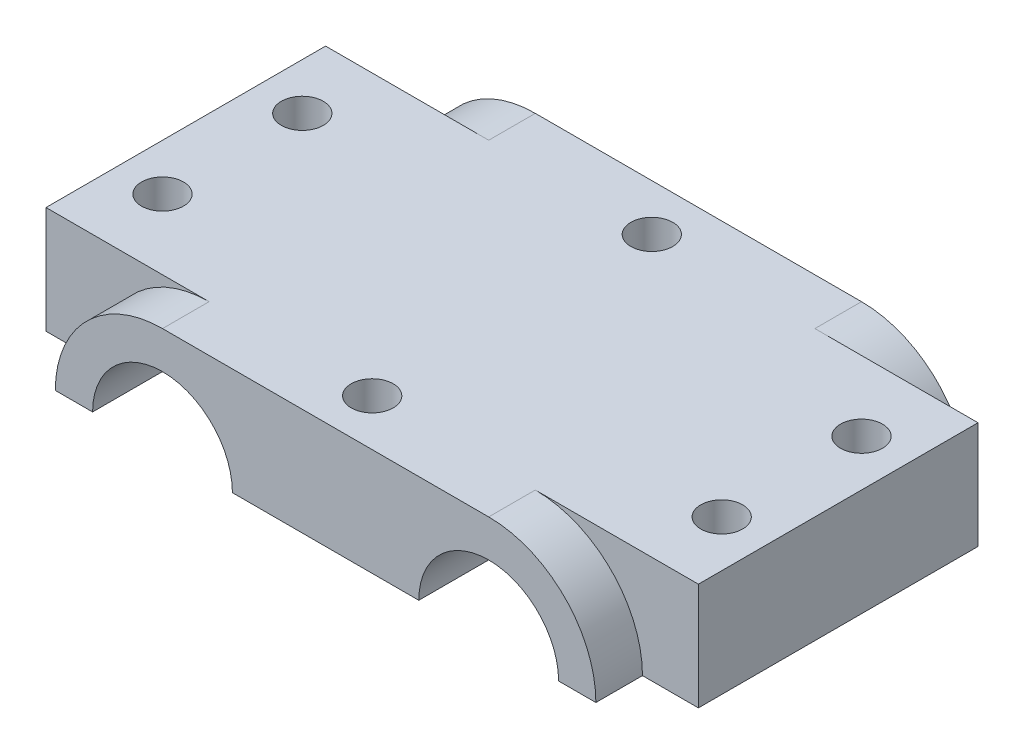
ISO-10303-21;
HEADER;
FILE_DESCRIPTION(('STEP AP214'),'2;1');
FILE_NAME('part.step','',(''),(''),'','','');
FILE_SCHEMA(('AUTOMOTIVE_DESIGN { 1 0 10303 214 1 1 1 1 }'));
ENDSEC;
DATA;
#1=APPLICATION_CONTEXT('core data for automotive mechanical design processes');
#2=APPLICATION_PROTOCOL_DEFINITION('international standard','automotive_design',2000,#1);
#3=PRODUCT_CONTEXT('',#1,'mechanical');
#4=PRODUCT('Part','Part','',(#3));
#5=PRODUCT_RELATED_PRODUCT_CATEGORY('part','',(#4));
#6=PRODUCT_DEFINITION_FORMATION('','',#4);
#7=PRODUCT_DEFINITION_CONTEXT('part definition',#1,'design');
#8=PRODUCT_DEFINITION('design','',#6,#7);
#9=PRODUCT_DEFINITION_SHAPE('','',#8);
#10=(LENGTH_UNIT() NAMED_UNIT(*) SI_UNIT(.MILLI.,.METRE.));
#11=(NAMED_UNIT(*) PLANE_ANGLE_UNIT() SI_UNIT($,.RADIAN.));
#12=(NAMED_UNIT(*) SI_UNIT($,.STERADIAN.) SOLID_ANGLE_UNIT());
#13=UNCERTAINTY_MEASURE_WITH_UNIT(LENGTH_MEASURE(1.E-05),#10,'distance_accuracy_value','');
#14=(GEOMETRIC_REPRESENTATION_CONTEXT(3) GLOBAL_UNCERTAINTY_ASSIGNED_CONTEXT((#13)) GLOBAL_UNIT_ASSIGNED_CONTEXT((#10,
#11,#12)) REPRESENTATION_CONTEXT('',''));
#15=CARTESIAN_POINT('',(0.,0.,0.));
#16=DIRECTION('',(0.,0.,1.));
#17=DIRECTION('',(1.,0.,0.));
#18=AXIS2_PLACEMENT_3D('',#15,#16,#17);
#19=CARTESIAN_POINT('',(35.,5.75,20.));
#20=DIRECTION('',(-1.,0.,0.));
#21=DIRECTION('',(0.,0.,1.));
#22=AXIS2_PLACEMENT_3D('',#19,#20,#21);
#23=PLANE('',#22);
#24=DIRECTION('',(0.,1.,0.));
#25=VECTOR('',#24,1.);
#26=CARTESIAN_POINT('',(35.,-5.75,-15.));
#27=LINE('',#26,#25);
#28=CARTESIAN_POINT('',(35.,-5.75,-15.));
#29=VERTEX_POINT('',#28);
#30=CARTESIAN_POINT('',(35.,5.75,-15.));
#31=VERTEX_POINT('',#30);
#32=EDGE_CURVE('E180',#29,#31,#27,.T.);
#33=ORIENTED_EDGE('',*,*,#32,.T.);
#34=DIRECTION('',(0.,0.,-1.));
#35=VECTOR('',#34,1.);
#36=CARTESIAN_POINT('',(35.,5.75,20.));
#37=LINE('',#36,#35);
#38=CARTESIAN_POINT('',(35.,5.75,15.));
#39=VERTEX_POINT('',#38);
#40=EDGE_CURVE('E11',#39,#31,#37,.T.);
#41=ORIENTED_EDGE('',*,*,#40,.F.);
#42=DIRECTION('',(0.,1.,0.));
#43=VECTOR('',#42,1.);
#44=CARTESIAN_POINT('',(35.,-5.75,15.));
#45=LINE('',#44,#43);
#46=CARTESIAN_POINT('',(35.,-5.75,15.));
#47=VERTEX_POINT('',#46);
#48=EDGE_CURVE('E226',#47,#39,#45,.T.);
#49=ORIENTED_EDGE('',*,*,#48,.F.);
#50=DIRECTION('',(0.,0.,-1.));
#51=VECTOR('',#50,1.);
#52=CARTESIAN_POINT('',(35.,-5.75,20.));
#53=LINE('',#52,#51);
#54=EDGE_CURVE('E303',#47,#29,#53,.T.);
#55=ORIENTED_EDGE('',*,*,#54,.T.);
#56=EDGE_LOOP('',(#33,#41,#49,#55));
#57=FACE_BOUND('',#56,.T.);
#58=ADVANCED_FACE('F45',(#57),#23,.F.);
#59=CARTESIAN_POINT('',(-35.,5.75,20.));
#60=DIRECTION('',(0.,-1.,0.));
#61=DIRECTION('',(0.,0.,-1.));
#62=AXIS2_PLACEMENT_3D('',#59,#60,#61);
#63=PLANE('',#62);
#64=CARTESIAN_POINT('',(0.,5.75,-15.));
#65=DIRECTION('',(0.,1.,0.));
#66=DIRECTION('',(0.,0.,1.));
#67=AXIS2_PLACEMENT_3D('',#64,#65,#66);
#68=CIRCLE('',#67,2.25000000000001);
#69=CARTESIAN_POINT('',(0.,5.75,-12.75));
#70=VERTEX_POINT('',#69);
#71=EDGE_CURVE('E549',#70,#70,#68,.T.);
#72=ORIENTED_EDGE('',*,*,#71,.F.);
#73=EDGE_LOOP('',(#72));
#74=FACE_BOUND('',#73,.T.);
#75=CARTESIAN_POINT('',(0.,5.75,15.));
#76=DIRECTION('',(0.,1.,0.));
#77=DIRECTION('',(0.,0.,1.));
#78=AXIS2_PLACEMENT_3D('',#75,#76,#77);
#79=CIRCLE('',#78,2.25000000000001);
#80=CARTESIAN_POINT('',(0.,5.75,17.25));
#81=VERTEX_POINT('',#80);
#82=EDGE_CURVE('E553',#81,#81,#79,.T.);
#83=ORIENTED_EDGE('',*,*,#82,.F.);
#84=EDGE_LOOP('',(#83));
#85=FACE_BOUND('',#84,.T.);
#86=CARTESIAN_POINT('',(-30.,5.75,7.5));
#87=DIRECTION('',(0.,1.,0.));
#88=DIRECTION('',(0.,0.,1.));
#89=AXIS2_PLACEMENT_3D('',#86,#87,#88);
#90=CIRCLE('',#89,2.25000000000001);
#91=CARTESIAN_POINT('',(-30.,5.75,9.75000000000001));
#92=VERTEX_POINT('',#91);
#93=EDGE_CURVE('E563',#92,#92,#90,.T.);
#94=ORIENTED_EDGE('',*,*,#93,.F.);
#95=EDGE_LOOP('',(#94));
#96=FACE_BOUND('',#95,.T.);
#97=CARTESIAN_POINT('',(-30.,5.75,-7.5));
#98=DIRECTION('',(0.,1.,0.));
#99=DIRECTION('',(0.,0.,1.));
#100=AXIS2_PLACEMENT_3D('',#97,#98,#99);
#101=CIRCLE('',#100,2.25000000000001);
#102=CARTESIAN_POINT('',(-30.,5.75,-5.24999999999999));
#103=VERTEX_POINT('',#102);
#104=EDGE_CURVE('E571',#103,#103,#101,.T.);
#105=ORIENTED_EDGE('',*,*,#104,.F.);
#106=EDGE_LOOP('',(#105));
#107=FACE_BOUND('',#106,.T.);
#108=CARTESIAN_POINT('',(30.,5.75,7.5));
#109=DIRECTION('',(0.,1.,0.));
#110=DIRECTION('',(0.,0.,1.));
#111=AXIS2_PLACEMENT_3D('',#108,#109,#110);
#112=CIRCLE('',#111,2.25000000000001);
#113=CARTESIAN_POINT('',(30.,5.75,9.75000000000001));
#114=VERTEX_POINT('',#113);
#115=EDGE_CURVE('E579',#114,#114,#112,.T.);
#116=ORIENTED_EDGE('',*,*,#115,.F.);
#117=EDGE_LOOP('',(#116));
#118=FACE_BOUND('',#117,.T.);
#119=CARTESIAN_POINT('',(30.,5.75,-7.5));
#120=DIRECTION('',(0.,1.,0.));
#121=DIRECTION('',(0.,0.,1.));
#122=AXIS2_PLACEMENT_3D('',#119,#120,#121);
#123=CIRCLE('',#122,2.25000000000001);
#124=CARTESIAN_POINT('',(30.,5.75,-5.24999999999999));
#125=VERTEX_POINT('',#124);
#126=EDGE_CURVE('E587',#125,#125,#123,.T.);
#127=ORIENTED_EDGE('',*,*,#126,.F.);
#128=EDGE_LOOP('',(#127));
#129=FACE_BOUND('',#128,.T.);
#130=DIRECTION('',(-1.,0.,0.));
#131=VECTOR('',#130,1.);
#132=CARTESIAN_POINT('',(35.,5.75,-15.));
#133=LINE('',#132,#131);
#134=CARTESIAN_POINT('',(17.5,5.75,-15.));
#135=VERTEX_POINT('',#134);
#136=EDGE_CURVE('E171',#31,#135,#133,.T.);
#137=ORIENTED_EDGE('',*,*,#136,.T.);
#138=DIRECTION('',(0.,0.,-1.));
#139=VECTOR('',#138,1.);
#140=CARTESIAN_POINT('',(17.5,5.75,-15.));
#141=LINE('',#140,#139);
#142=CARTESIAN_POINT('',(17.5,5.75,-20.));
#143=VERTEX_POINT('',#142);
#144=EDGE_CURVE('E157',#135,#143,#141,.T.);
#145=ORIENTED_EDGE('',*,*,#144,.T.);
#146=DIRECTION('',(-1.,0.,0.));
#147=VECTOR('',#146,1.);
#148=CARTESIAN_POINT('',(-35.,5.75,-20.));
#149=LINE('',#148,#147);
#150=CARTESIAN_POINT('',(-17.5,5.75,-20.));
#151=VERTEX_POINT('',#150);
#152=EDGE_CURVE('E278',#143,#151,#149,.T.);
#153=ORIENTED_EDGE('',*,*,#152,.T.);
#154=DIRECTION('',(0.,0.,-1.));
#155=VECTOR('',#154,1.);
#156=CARTESIAN_POINT('',(-17.5,5.74999999999999,-15.));
#157=LINE('',#156,#155);
#158=CARTESIAN_POINT('',(-17.5,5.74999999999999,-15.));
#159=VERTEX_POINT('',#158);
#160=EDGE_CURVE('E68',#159,#151,#157,.T.);
#161=ORIENTED_EDGE('',*,*,#160,.F.);
#162=DIRECTION('',(-1.,0.,0.));
#163=VECTOR('',#162,1.);
#164=CARTESIAN_POINT('',(-17.5,5.74999999999999,-15.));
#165=LINE('',#164,#163);
#166=CARTESIAN_POINT('',(-35.,5.75,-15.));
#167=VERTEX_POINT('',#166);
#168=EDGE_CURVE('E194',#159,#167,#165,.T.);
#169=ORIENTED_EDGE('',*,*,#168,.T.);
#170=DIRECTION('',(0.,0.,-1.));
#171=VECTOR('',#170,1.);
#172=CARTESIAN_POINT('',(-35.,5.75,20.));
#173=LINE('',#172,#171);
#174=CARTESIAN_POINT('',(-35.,5.75,15.));
#175=VERTEX_POINT('',#174);
#176=EDGE_CURVE('E53',#175,#167,#173,.T.);
#177=ORIENTED_EDGE('',*,*,#176,.F.);
#178=DIRECTION('',(-1.,0.,0.));
#179=VECTOR('',#178,1.);
#180=CARTESIAN_POINT('',(-17.5,5.74999999999999,15.));
#181=LINE('',#180,#179);
#182=CARTESIAN_POINT('',(-17.5,5.74999999999999,15.));
#183=VERTEX_POINT('',#182);
#184=EDGE_CURVE('E253',#183,#175,#181,.T.);
#185=ORIENTED_EDGE('',*,*,#184,.F.);
#186=DIRECTION('',(0.,0.,1.));
#187=VECTOR('',#186,1.);
#188=CARTESIAN_POINT('',(-17.5,5.74999999999999,15.));
#189=LINE('',#188,#187);
#190=CARTESIAN_POINT('',(-17.5,5.74999999999999,20.));
#191=VERTEX_POINT('',#190);
#192=EDGE_CURVE('E192',#183,#191,#189,.T.);
#193=ORIENTED_EDGE('',*,*,#192,.T.);
#194=DIRECTION('',(-1.,0.,0.));
#195=VECTOR('',#194,1.);
#196=CARTESIAN_POINT('',(-35.,5.75,20.));
#197=LINE('',#196,#195);
#198=CARTESIAN_POINT('',(17.5,5.75,20.));
#199=VERTEX_POINT('',#198);
#200=EDGE_CURVE('E294',#199,#191,#197,.T.);
#201=ORIENTED_EDGE('',*,*,#200,.F.);
#202=DIRECTION('',(0.,0.,1.));
#203=VECTOR('',#202,1.);
#204=CARTESIAN_POINT('',(17.5,5.75,15.));
#205=LINE('',#204,#203);
#206=CARTESIAN_POINT('',(17.5,5.75,15.));
#207=VERTEX_POINT('',#206);
#208=EDGE_CURVE('E237',#207,#199,#205,.T.);
#209=ORIENTED_EDGE('',*,*,#208,.F.);
#210=DIRECTION('',(-1.,0.,0.));
#211=VECTOR('',#210,1.);
#212=CARTESIAN_POINT('',(35.,5.75,15.));
#213=LINE('',#212,#211);
#214=EDGE_CURVE('E229',#39,#207,#213,.T.);
#215=ORIENTED_EDGE('',*,*,#214,.F.);
#216=ORIENTED_EDGE('',*,*,#40,.T.);
#217=EDGE_LOOP('',(#137,#145,#153,#161,#169,#177,#185,#193,#201,#209,#215,#216));
#218=FACE_BOUND('',#217,.T.);
#219=ADVANCED_FACE('F176',(#74,#85,#96,#107,#118,#129,#218),#63,.F.);
#220=CARTESIAN_POINT('',(-35.,-5.75,20.));
#221=DIRECTION('',(0.,1.,0.));
#222=DIRECTION('',(0.,0.,1.));
#223=AXIS2_PLACEMENT_3D('',#220,#221,#222);
#224=PLANE('',#223);
#225=CARTESIAN_POINT('',(-30.,-5.75,7.5));
#226=DIRECTION('',(0.,1.,0.));
#227=DIRECTION('',(0.,0.,1.));
#228=AXIS2_PLACEMENT_3D('',#225,#226,#227);
#229=CIRCLE('',#228,2.25000000000001);
#230=CARTESIAN_POINT('',(-30.,-5.75,9.75000000000001));
#231=VERTEX_POINT('',#230);
#232=EDGE_CURVE('E567',#231,#231,#229,.T.);
#233=ORIENTED_EDGE('',*,*,#232,.T.);
#234=EDGE_LOOP('',(#233));
#235=FACE_BOUND('',#234,.T.);
#236=CARTESIAN_POINT('',(-30.,-5.75,-7.5));
#237=DIRECTION('',(0.,1.,0.));
#238=DIRECTION('',(0.,0.,1.));
#239=AXIS2_PLACEMENT_3D('',#236,#237,#238);
#240=CIRCLE('',#239,2.25000000000001);
#241=CARTESIAN_POINT('',(-30.,-5.75,-5.24999999999999));
#242=VERTEX_POINT('',#241);
#243=EDGE_CURVE('E575',#242,#242,#240,.T.);
#244=ORIENTED_EDGE('',*,*,#243,.T.);
#245=EDGE_LOOP('',(#244));
#246=FACE_BOUND('',#245,.T.);
#247=DIRECTION('',(0.,0.,-1.));
#248=VECTOR('',#247,1.);
#249=CARTESIAN_POINT('',(-29.,-5.75,-15.));
#250=LINE('',#249,#248);
#251=CARTESIAN_POINT('',(-29.,-5.75,-15.));
#252=VERTEX_POINT('',#251);
#253=CARTESIAN_POINT('',(-29.,-5.75,-20.));
#254=VERTEX_POINT('',#253);
#255=EDGE_CURVE('E190',#252,#254,#250,.T.);
#256=ORIENTED_EDGE('',*,*,#255,.T.);
#257=DIRECTION('',(1.,0.,0.));
#258=VECTOR('',#257,1.);
#259=CARTESIAN_POINT('',(-35.,-5.75,-20.));
#260=LINE('',#259,#258);
#261=CARTESIAN_POINT('',(-25.,-5.75,-20.));
#262=VERTEX_POINT('',#261);
#263=EDGE_CURVE('E299',#254,#262,#260,.T.);
#264=ORIENTED_EDGE('',*,*,#263,.T.);
#265=DIRECTION('',(0.,0.,1.));
#266=VECTOR('',#265,1.);
#267=CARTESIAN_POINT('',(-25.,-5.75,-20.));
#268=LINE('',#267,#266);
#269=CARTESIAN_POINT('',(-25.,-5.75,20.));
#270=VERTEX_POINT('',#269);
#271=EDGE_CURVE('E269',#262,#270,#268,.T.);
#272=ORIENTED_EDGE('',*,*,#271,.T.);
#273=DIRECTION('',(1.,0.,0.));
#274=VECTOR('',#273,1.);
#275=CARTESIAN_POINT('',(-35.,-5.75,20.));
#276=LINE('',#275,#274);
#277=CARTESIAN_POINT('',(-29.,-5.75,20.));
#278=VERTEX_POINT('',#277);
#279=EDGE_CURVE('E300',#278,#270,#276,.T.);
#280=ORIENTED_EDGE('',*,*,#279,.F.);
#281=DIRECTION('',(0.,0.,1.));
#282=VECTOR('',#281,1.);
#283=CARTESIAN_POINT('',(-29.,-5.75,15.));
#284=LINE('',#283,#282);
#285=CARTESIAN_POINT('',(-29.,-5.75,15.));
#286=VERTEX_POINT('',#285);
#287=EDGE_CURVE('E244',#286,#278,#284,.T.);
#288=ORIENTED_EDGE('',*,*,#287,.F.);
#289=DIRECTION('',(1.,0.,0.));
#290=VECTOR('',#289,1.);
#291=CARTESIAN_POINT('',(-35.,-5.75,15.));
#292=LINE('',#291,#290);
#293=CARTESIAN_POINT('',(-35.,-5.75,15.));
#294=VERTEX_POINT('',#293);
#295=EDGE_CURVE('E257',#294,#286,#292,.T.);
#296=ORIENTED_EDGE('',*,*,#295,.F.);
#297=DIRECTION('',(0.,0.,-1.));
#298=VECTOR('',#297,1.);
#299=CARTESIAN_POINT('',(-35.,-5.75,20.));
#300=LINE('',#299,#298);
#301=CARTESIAN_POINT('',(-35.,-5.75,-15.));
#302=VERTEX_POINT('',#301);
#303=EDGE_CURVE('E314',#294,#302,#300,.T.);
#304=ORIENTED_EDGE('',*,*,#303,.T.);
#305=DIRECTION('',(1.,0.,0.));
#306=VECTOR('',#305,1.);
#307=CARTESIAN_POINT('',(-35.,-5.75,-15.));
#308=LINE('',#307,#306);
#309=EDGE_CURVE('E202',#302,#252,#308,.T.);
#310=ORIENTED_EDGE('',*,*,#309,.T.);
#311=EDGE_LOOP('',(#256,#264,#272,#280,#288,#296,#304,#310));
#312=FACE_BOUND('',#311,.T.);
#313=ADVANCED_FACE('F330',(#235,#246,#312),#224,.F.);
#314=CARTESIAN_POINT('',(30.,-5.75,7.5));
#315=DIRECTION('',(0.,1.,0.));
#316=DIRECTION('',(0.,0.,1.));
#317=AXIS2_PLACEMENT_3D('',#314,#315,#316);
#318=CIRCLE('',#317,2.25000000000001);
#319=CARTESIAN_POINT('',(30.,-5.75,9.75000000000001));
#320=VERTEX_POINT('',#319);
#321=EDGE_CURVE('E583',#320,#320,#318,.T.);
#322=ORIENTED_EDGE('',*,*,#321,.T.);
#323=EDGE_LOOP('',(#322));
#324=FACE_BOUND('',#323,.T.);
#325=CARTESIAN_POINT('',(30.,-5.75,-7.5));
#326=DIRECTION('',(0.,1.,0.));
#327=DIRECTION('',(0.,0.,1.));
#328=AXIS2_PLACEMENT_3D('',#325,#326,#327);
#329=CIRCLE('',#328,2.25000000000001);
#330=CARTESIAN_POINT('',(30.,-5.75,-5.24999999999999));
#331=VERTEX_POINT('',#330);
#332=EDGE_CURVE('E212',#331,#331,#329,.T.);
#333=ORIENTED_EDGE('',*,*,#332,.T.);
#334=EDGE_LOOP('',(#333));
#335=FACE_BOUND('',#334,.T.);
#336=DIRECTION('',(0.,0.,-1.));
#337=VECTOR('',#336,1.);
#338=CARTESIAN_POINT('',(29.,-5.75,-15.));
#339=LINE('',#338,#337);
#340=CARTESIAN_POINT('',(29.,-5.75,-15.));
#341=VERTEX_POINT('',#340);
#342=CARTESIAN_POINT('',(29.,-5.75,-20.));
#343=VERTEX_POINT('',#342);
#344=EDGE_CURVE('E60',#341,#343,#339,.T.);
#345=ORIENTED_EDGE('',*,*,#344,.F.);
#346=DIRECTION('',(1.,0.,0.));
#347=VECTOR('',#346,1.);
#348=CARTESIAN_POINT('',(29.,-5.75,-15.));
#349=LINE('',#348,#347);
#350=EDGE_CURVE('E167',#341,#29,#349,.T.);
#351=ORIENTED_EDGE('',*,*,#350,.T.);
#352=ORIENTED_EDGE('',*,*,#54,.F.);
#353=DIRECTION('',(1.,0.,0.));
#354=VECTOR('',#353,1.);
#355=CARTESIAN_POINT('',(29.,-5.75,15.));
#356=LINE('',#355,#354);
#357=CARTESIAN_POINT('',(29.,-5.75,15.));
#358=VERTEX_POINT('',#357);
#359=EDGE_CURVE('E222',#358,#47,#356,.T.);
#360=ORIENTED_EDGE('',*,*,#359,.F.);
#361=DIRECTION('',(0.,0.,1.));
#362=VECTOR('',#361,1.);
#363=CARTESIAN_POINT('',(29.,-5.75,15.));
#364=LINE('',#363,#362);
#365=CARTESIAN_POINT('',(29.,-5.75,20.));
#366=VERTEX_POINT('',#365);
#367=EDGE_CURVE('E233',#358,#366,#364,.T.);
#368=ORIENTED_EDGE('',*,*,#367,.T.);
#369=CARTESIAN_POINT('',(25.,-5.75,20.));
#370=VERTEX_POINT('',#369);
#371=EDGE_CURVE('E298',#370,#366,#276,.T.);
#372=ORIENTED_EDGE('',*,*,#371,.F.);
#373=DIRECTION('',(0.,0.,1.));
#374=VECTOR('',#373,1.);
#375=CARTESIAN_POINT('',(25.,-5.75,-20.));
#376=LINE('',#375,#374);
#377=CARTESIAN_POINT('',(25.,-5.75,-20.));
#378=VERTEX_POINT('',#377);
#379=EDGE_CURVE('E240',#378,#370,#376,.T.);
#380=ORIENTED_EDGE('',*,*,#379,.F.);
#381=EDGE_CURVE('E307',#378,#343,#260,.T.);
#382=ORIENTED_EDGE('',*,*,#381,.T.);
#383=EDGE_LOOP('',(#345,#351,#352,#360,#368,#372,#380,#382));
#384=FACE_BOUND('',#383,.T.);
#385=ADVANCED_FACE('F353',(#324,#335,#384),#224,.F.);
#386=CARTESIAN_POINT('',(0.,0.,-20.));
#387=DIRECTION('',(0.,0.,1.));
#388=DIRECTION('',(1.,0.,0.));
#389=AXIS2_PLACEMENT_3D('',#386,#387,#388);
#390=PLANE('',#389);
#391=CARTESIAN_POINT('',(17.5,-5.75,-20.));
#392=DIRECTION('',(0.,0.,-1.));
#393=DIRECTION('',(1.,0.,0.));
#394=AXIS2_PLACEMENT_3D('',#391,#392,#393);
#395=CIRCLE('',#394,11.5);
#396=EDGE_CURVE('E161',#143,#343,#395,.T.);
#397=ORIENTED_EDGE('',*,*,#396,.T.);
#398=ORIENTED_EDGE('',*,*,#381,.F.);
#399=CARTESIAN_POINT('',(17.5,-5.75,-20.));
#400=DIRECTION('',(0.,0.,1.));
#401=DIRECTION('',(-1.,0.,0.));
#402=AXIS2_PLACEMENT_3D('',#399,#400,#401);
#403=CIRCLE('',#402,7.5);
#404=CARTESIAN_POINT('',(10.,-5.75,-20.));
#405=VERTEX_POINT('',#404);
#406=EDGE_CURVE('E286',#378,#405,#403,.T.);
#407=ORIENTED_EDGE('',*,*,#406,.T.);
#408=CARTESIAN_POINT('',(-10.,-5.75,-20.));
#409=VERTEX_POINT('',#408);
#410=EDGE_CURVE('E310',#409,#405,#260,.T.);
#411=ORIENTED_EDGE('',*,*,#410,.F.);
#412=CARTESIAN_POINT('',(-17.5,-5.75,-20.));
#413=DIRECTION('',(0.,0.,1.));
#414=DIRECTION('',(-1.,0.,0.));
#415=AXIS2_PLACEMENT_3D('',#412,#413,#414);
#416=CIRCLE('',#415,7.5);
#417=EDGE_CURVE('E265',#409,#262,#416,.T.);
#418=ORIENTED_EDGE('',*,*,#417,.T.);
#419=ORIENTED_EDGE('',*,*,#263,.F.);
#420=CARTESIAN_POINT('',(-17.5,-5.75,-20.));
#421=DIRECTION('',(0.,0.,-1.));
#422=DIRECTION('',(-1.,0.,0.));
#423=AXIS2_PLACEMENT_3D('',#420,#421,#422);
#424=CIRCLE('',#423,11.5);
#425=EDGE_CURVE('E199',#254,#151,#424,.T.);
#426=ORIENTED_EDGE('',*,*,#425,.T.);
#427=ORIENTED_EDGE('',*,*,#152,.F.);
#428=EDGE_LOOP('',(#397,#398,#407,#411,#418,#419,#426,#427));
#429=FACE_BOUND('',#428,.T.);
#430=ADVANCED_FACE('F372',(#429),#390,.F.);
#431=CARTESIAN_POINT('',(0.,-5.75,-15.));
#432=DIRECTION('',(0.,1.,0.));
#433=DIRECTION('',(0.,0.,1.));
#434=AXIS2_PLACEMENT_3D('',#431,#432,#433);
#435=CIRCLE('',#434,2.25000000000001);
#436=CARTESIAN_POINT('',(0.,-5.75,-12.75));
#437=VERTEX_POINT('',#436);
#438=EDGE_CURVE('E547',#437,#437,#435,.T.);
#439=ORIENTED_EDGE('',*,*,#438,.T.);
#440=EDGE_LOOP('',(#439));
#441=FACE_BOUND('',#440,.T.);
#442=CARTESIAN_POINT('',(0.,-5.75,15.));
#443=DIRECTION('',(0.,1.,0.));
#444=DIRECTION('',(0.,0.,1.));
#445=AXIS2_PLACEMENT_3D('',#442,#443,#444);
#446=CIRCLE('',#445,2.25000000000001);
#447=CARTESIAN_POINT('',(0.,-5.75,17.25));
#448=VERTEX_POINT('',#447);
#449=EDGE_CURVE('E559',#448,#448,#446,.T.);
#450=ORIENTED_EDGE('',*,*,#449,.T.);
#451=EDGE_LOOP('',(#450));
#452=FACE_BOUND('',#451,.T.);
#453=CARTESIAN_POINT('',(-10.,-5.75,20.));
#454=VERTEX_POINT('',#453);
#455=CARTESIAN_POINT('',(10.,-5.75,20.));
#456=VERTEX_POINT('',#455);
#457=EDGE_CURVE('E304',#454,#456,#276,.T.);
#458=ORIENTED_EDGE('',*,*,#457,.F.);
#459=DIRECTION('',(0.,0.,1.));
#460=VECTOR('',#459,1.);
#461=CARTESIAN_POINT('',(-10.,-5.75,-20.));
#462=LINE('',#461,#460);
#463=EDGE_CURVE('E275',#409,#454,#462,.T.);
#464=ORIENTED_EDGE('',*,*,#463,.F.);
#465=ORIENTED_EDGE('',*,*,#410,.T.);
#466=DIRECTION('',(0.,0.,1.));
#467=VECTOR('',#466,1.);
#468=CARTESIAN_POINT('',(10.,-5.75,-20.));
#469=LINE('',#468,#467);
#470=EDGE_CURVE('E282',#405,#456,#469,.T.);
#471=ORIENTED_EDGE('',*,*,#470,.T.);
#472=EDGE_LOOP('',(#458,#464,#465,#471));
#473=FACE_BOUND('',#472,.T.);
#474=ADVANCED_FACE('F370',(#441,#452,#473),#224,.F.);
#475=CARTESIAN_POINT('',(-35.,5.75,20.));
#476=DIRECTION('',(1.,0.,0.));
#477=DIRECTION('',(0.,0.,-1.));
#478=AXIS2_PLACEMENT_3D('',#475,#476,#477);
#479=PLANE('',#478);
#480=ORIENTED_EDGE('',*,*,#176,.T.);
#481=DIRECTION('',(0.,-1.,0.));
#482=VECTOR('',#481,1.);
#483=CARTESIAN_POINT('',(-35.,5.75,-15.));
#484=LINE('',#483,#482);
#485=EDGE_CURVE('E206',#167,#302,#484,.T.);
#486=ORIENTED_EDGE('',*,*,#485,.T.);
#487=ORIENTED_EDGE('',*,*,#303,.F.);
#488=DIRECTION('',(0.,-1.,0.));
#489=VECTOR('',#488,1.);
#490=CARTESIAN_POINT('',(-35.,5.75,15.));
#491=LINE('',#490,#489);
#492=EDGE_CURVE('E260',#175,#294,#491,.T.);
#493=ORIENTED_EDGE('',*,*,#492,.F.);
#494=EDGE_LOOP('',(#480,#486,#487,#493));
#495=FACE_BOUND('',#494,.T.);
#496=ADVANCED_FACE('F322',(#495),#479,.F.);
#497=CARTESIAN_POINT('',(0.,0.,20.));
#498=DIRECTION('',(0.,0.,1.));
#499=DIRECTION('',(1.,0.,0.));
#500=AXIS2_PLACEMENT_3D('',#497,#498,#499);
#501=PLANE('',#500);
#502=CARTESIAN_POINT('',(17.5,-5.75,20.));
#503=DIRECTION('',(0.,0.,-1.));
#504=DIRECTION('',(1.,0.,0.));
#505=AXIS2_PLACEMENT_3D('',#502,#503,#504);
#506=CIRCLE('',#505,11.5);
#507=EDGE_CURVE('E223',#199,#366,#506,.T.);
#508=ORIENTED_EDGE('',*,*,#507,.F.);
#509=ORIENTED_EDGE('',*,*,#200,.T.);
#510=CARTESIAN_POINT('',(-17.5,-5.75,20.));
#511=DIRECTION('',(0.,0.,-1.));
#512=DIRECTION('',(-1.,0.,0.));
#513=AXIS2_PLACEMENT_3D('',#510,#511,#512);
#514=CIRCLE('',#513,11.5);
#515=EDGE_CURVE('E236',#278,#191,#514,.T.);
#516=ORIENTED_EDGE('',*,*,#515,.F.);
#517=ORIENTED_EDGE('',*,*,#279,.T.);
#518=CARTESIAN_POINT('',(-17.5,-5.75,20.));
#519=DIRECTION('',(0.,0.,1.));
#520=DIRECTION('',(-1.,0.,0.));
#521=AXIS2_PLACEMENT_3D('',#518,#519,#520);
#522=CIRCLE('',#521,7.5);
#523=EDGE_CURVE('E270',#454,#270,#522,.T.);
#524=ORIENTED_EDGE('',*,*,#523,.F.);
#525=ORIENTED_EDGE('',*,*,#457,.T.);
#526=CARTESIAN_POINT('',(17.5,-5.75,20.));
#527=DIRECTION('',(0.,0.,1.));
#528=DIRECTION('',(-1.,0.,0.));
#529=AXIS2_PLACEMENT_3D('',#526,#527,#528);
#530=CIRCLE('',#529,7.5);
#531=EDGE_CURVE('E274',#370,#456,#530,.T.);
#532=ORIENTED_EDGE('',*,*,#531,.F.);
#533=ORIENTED_EDGE('',*,*,#371,.T.);
#534=EDGE_LOOP('',(#508,#509,#516,#517,#524,#525,#532,#533));
#535=FACE_BOUND('',#534,.T.);
#536=ADVANCED_FACE('F345',(#535),#501,.T.);
#537=CARTESIAN_POINT('',(17.5,-5.75,-20.));
#538=DIRECTION('',(0.,0.,1.));
#539=DIRECTION('',(1.,0.,0.));
#540=AXIS2_PLACEMENT_3D('',#537,#538,#539);
#541=CYLINDRICAL_SURFACE('',#540,7.5);
#542=ORIENTED_EDGE('',*,*,#531,.T.);
#543=ORIENTED_EDGE('',*,*,#470,.F.);
#544=ORIENTED_EDGE('',*,*,#406,.F.);
#545=ORIENTED_EDGE('',*,*,#379,.T.);
#546=EDGE_LOOP('',(#542,#543,#544,#545));
#547=FACE_BOUND('',#546,.T.);
#548=ADVANCED_FACE('F374',(#547),#541,.F.);
#549=CARTESIAN_POINT('',(-17.5,-5.75,-20.));
#550=DIRECTION('',(0.,0.,1.));
#551=DIRECTION('',(1.,0.,0.));
#552=AXIS2_PLACEMENT_3D('',#549,#550,#551);
#553=CYLINDRICAL_SURFACE('',#552,7.5);
#554=ORIENTED_EDGE('',*,*,#523,.T.);
#555=ORIENTED_EDGE('',*,*,#271,.F.);
#556=ORIENTED_EDGE('',*,*,#417,.F.);
#557=ORIENTED_EDGE('',*,*,#463,.T.);
#558=EDGE_LOOP('',(#554,#555,#556,#557));
#559=FACE_BOUND('',#558,.T.);
#560=ADVANCED_FACE('F380',(#559),#553,.F.);
#561=CARTESIAN_POINT('',(-17.5,-5.75,15.));
#562=DIRECTION('',(0.,0.,1.));
#563=DIRECTION('',(1.,0.,0.));
#564=AXIS2_PLACEMENT_3D('',#561,#562,#563);
#565=CYLINDRICAL_SURFACE('',#564,11.5);
#566=ORIENTED_EDGE('',*,*,#515,.T.);
#567=ORIENTED_EDGE('',*,*,#192,.F.);
#568=CARTESIAN_POINT('',(-17.5,-5.75,15.));
#569=DIRECTION('',(0.,0.,-1.));
#570=DIRECTION('',(-1.,0.,0.));
#571=AXIS2_PLACEMENT_3D('',#568,#569,#570);
#572=CIRCLE('',#571,11.5);
#573=EDGE_CURVE('E247',#286,#183,#572,.T.);
#574=ORIENTED_EDGE('',*,*,#573,.F.);
#575=ORIENTED_EDGE('',*,*,#287,.T.);
#576=EDGE_LOOP('',(#566,#567,#574,#575));
#577=FACE_BOUND('',#576,.T.);
#578=ADVANCED_FACE('F339',(#577),#565,.T.);
#579=CARTESIAN_POINT('',(-17.5,-5.75,15.));
#580=DIRECTION('',(0.,0.,-1.));
#581=DIRECTION('',(-1.,0.,0.));
#582=AXIS2_PLACEMENT_3D('',#579,#580,#581);
#583=PLANE('',#582);
#584=ORIENTED_EDGE('',*,*,#184,.T.);
#585=ORIENTED_EDGE('',*,*,#492,.T.);
#586=ORIENTED_EDGE('',*,*,#295,.T.);
#587=ORIENTED_EDGE('',*,*,#573,.T.);
#588=EDGE_LOOP('',(#584,#585,#586,#587));
#589=FACE_BOUND('',#588,.T.);
#590=ADVANCED_FACE('F337',(#589),#583,.F.);
#591=CARTESIAN_POINT('',(17.5,-5.75,15.));
#592=DIRECTION('',(0.,0.,1.));
#593=DIRECTION('',(1.,0.,0.));
#594=AXIS2_PLACEMENT_3D('',#591,#592,#593);
#595=CYLINDRICAL_SURFACE('',#594,11.5);
#596=ORIENTED_EDGE('',*,*,#507,.T.);
#597=ORIENTED_EDGE('',*,*,#367,.F.);
#598=CARTESIAN_POINT('',(17.5,-5.75,15.));
#599=DIRECTION('',(0.,0.,-1.));
#600=DIRECTION('',(1.,0.,0.));
#601=AXIS2_PLACEMENT_3D('',#598,#599,#600);
#602=CIRCLE('',#601,11.5);
#603=EDGE_CURVE('E218',#207,#358,#602,.T.);
#604=ORIENTED_EDGE('',*,*,#603,.F.);
#605=ORIENTED_EDGE('',*,*,#208,.T.);
#606=EDGE_LOOP('',(#596,#597,#604,#605));
#607=FACE_BOUND('',#606,.T.);
#608=ADVANCED_FACE('F350',(#607),#595,.T.);
#609=CARTESIAN_POINT('',(17.5,-5.75,15.));
#610=DIRECTION('',(0.,0.,1.));
#611=DIRECTION('',(1.,0.,0.));
#612=AXIS2_PLACEMENT_3D('',#609,#610,#611);
#613=PLANE('',#612);
#614=ORIENTED_EDGE('',*,*,#603,.T.);
#615=ORIENTED_EDGE('',*,*,#359,.T.);
#616=ORIENTED_EDGE('',*,*,#48,.T.);
#617=ORIENTED_EDGE('',*,*,#214,.T.);
#618=EDGE_LOOP('',(#614,#615,#616,#617));
#619=FACE_BOUND('',#618,.T.);
#620=ADVANCED_FACE('F358',(#619),#613,.T.);
#621=CARTESIAN_POINT('',(-17.5,-5.75,-15.));
#622=DIRECTION('',(0.,0.,-1.));
#623=DIRECTION('',(-1.,0.,0.));
#624=AXIS2_PLACEMENT_3D('',#621,#622,#623);
#625=CYLINDRICAL_SURFACE('',#624,11.5);
#626=ORIENTED_EDGE('',*,*,#425,.F.);
#627=ORIENTED_EDGE('',*,*,#255,.F.);
#628=CARTESIAN_POINT('',(-17.5,-5.75,-15.));
#629=DIRECTION('',(0.,0.,-1.));
#630=DIRECTION('',(-1.,0.,0.));
#631=AXIS2_PLACEMENT_3D('',#628,#629,#630);
#632=CIRCLE('',#631,11.5);
#633=EDGE_CURVE('E198',#252,#159,#632,.T.);
#634=ORIENTED_EDGE('',*,*,#633,.T.);
#635=ORIENTED_EDGE('',*,*,#160,.T.);
#636=EDGE_LOOP('',(#626,#627,#634,#635));
#637=FACE_BOUND('',#636,.T.);
#638=ADVANCED_FACE('F381',(#637),#625,.T.);
#639=CARTESIAN_POINT('',(-17.5,-5.75,-15.));
#640=DIRECTION('',(0.,0.,1.));
#641=DIRECTION('',(-1.,0.,0.));
#642=AXIS2_PLACEMENT_3D('',#639,#640,#641);
#643=PLANE('',#642);
#644=ORIENTED_EDGE('',*,*,#168,.F.);
#645=ORIENTED_EDGE('',*,*,#633,.F.);
#646=ORIENTED_EDGE('',*,*,#309,.F.);
#647=ORIENTED_EDGE('',*,*,#485,.F.);
#648=EDGE_LOOP('',(#644,#645,#646,#647));
#649=FACE_BOUND('',#648,.T.);
#650=ADVANCED_FACE('F328',(#649),#643,.F.);
#651=CARTESIAN_POINT('',(17.5,-5.75,-15.));
#652=DIRECTION('',(0.,0.,-1.));
#653=DIRECTION('',(-1.,0.,0.));
#654=AXIS2_PLACEMENT_3D('',#651,#652,#653);
#655=CYLINDRICAL_SURFACE('',#654,11.5);
#656=ORIENTED_EDGE('',*,*,#396,.F.);
#657=ORIENTED_EDGE('',*,*,#144,.F.);
#658=CARTESIAN_POINT('',(17.5,-5.75,-15.));
#659=DIRECTION('',(0.,0.,-1.));
#660=DIRECTION('',(1.,0.,0.));
#661=AXIS2_PLACEMENT_3D('',#658,#659,#660);
#662=CIRCLE('',#661,11.5);
#663=EDGE_CURVE('E160',#135,#341,#662,.T.);
#664=ORIENTED_EDGE('',*,*,#663,.T.);
#665=ORIENTED_EDGE('',*,*,#344,.T.);
#666=EDGE_LOOP('',(#656,#657,#664,#665));
#667=FACE_BOUND('',#666,.T.);
#668=ADVANCED_FACE('F159',(#667),#655,.T.);
#669=CARTESIAN_POINT('',(17.5,-5.75,-15.));
#670=DIRECTION('',(0.,0.,-1.));
#671=DIRECTION('',(1.,0.,0.));
#672=AXIS2_PLACEMENT_3D('',#669,#670,#671);
#673=PLANE('',#672);
#674=ORIENTED_EDGE('',*,*,#663,.F.);
#675=ORIENTED_EDGE('',*,*,#136,.F.);
#676=ORIENTED_EDGE('',*,*,#32,.F.);
#677=ORIENTED_EDGE('',*,*,#350,.F.);
#678=EDGE_LOOP('',(#674,#675,#676,#677));
#679=FACE_BOUND('',#678,.T.);
#680=ADVANCED_FACE('F170',(#679),#673,.T.);
#681=CARTESIAN_POINT('',(30.,5.75,-7.5));
#682=DIRECTION('',(0.,1.,0.));
#683=DIRECTION('',(0.,0.,1.));
#684=AXIS2_PLACEMENT_3D('',#681,#682,#683);
#685=CYLINDRICAL_SURFACE('',#684,2.25000000000001);
#686=ORIENTED_EDGE('',*,*,#332,.F.);
#687=EDGE_LOOP('',(#686));
#688=FACE_BOUND('',#687,.T.);
#689=ORIENTED_EDGE('',*,*,#126,.T.);
#690=EDGE_LOOP('',(#689));
#691=FACE_BOUND('',#690,.T.);
#692=ADVANCED_FACE('F483',(#688,#691),#685,.F.);
#693=CARTESIAN_POINT('',(30.,5.75,7.5));
#694=DIRECTION('',(0.,1.,0.));
#695=DIRECTION('',(0.,0.,1.));
#696=AXIS2_PLACEMENT_3D('',#693,#694,#695);
#697=CYLINDRICAL_SURFACE('',#696,2.25000000000001);
#698=ORIENTED_EDGE('',*,*,#321,.F.);
#699=EDGE_LOOP('',(#698));
#700=FACE_BOUND('',#699,.T.);
#701=ORIENTED_EDGE('',*,*,#115,.T.);
#702=EDGE_LOOP('',(#701));
#703=FACE_BOUND('',#702,.T.);
#704=ADVANCED_FACE('F492',(#700,#703),#697,.F.);
#705=CARTESIAN_POINT('',(-30.,5.75,-7.5));
#706=DIRECTION('',(0.,1.,0.));
#707=DIRECTION('',(0.,0.,1.));
#708=AXIS2_PLACEMENT_3D('',#705,#706,#707);
#709=CYLINDRICAL_SURFACE('',#708,2.25000000000001);
#710=ORIENTED_EDGE('',*,*,#243,.F.);
#711=EDGE_LOOP('',(#710));
#712=FACE_BOUND('',#711,.T.);
#713=ORIENTED_EDGE('',*,*,#104,.T.);
#714=EDGE_LOOP('',(#713));
#715=FACE_BOUND('',#714,.T.);
#716=ADVANCED_FACE('F502',(#712,#715),#709,.F.);
#717=CARTESIAN_POINT('',(-30.,5.75,7.5));
#718=DIRECTION('',(0.,1.,0.));
#719=DIRECTION('',(0.,0.,1.));
#720=AXIS2_PLACEMENT_3D('',#717,#718,#719);
#721=CYLINDRICAL_SURFACE('',#720,2.25000000000001);
#722=ORIENTED_EDGE('',*,*,#232,.F.);
#723=EDGE_LOOP('',(#722));
#724=FACE_BOUND('',#723,.T.);
#725=ORIENTED_EDGE('',*,*,#93,.T.);
#726=EDGE_LOOP('',(#725));
#727=FACE_BOUND('',#726,.T.);
#728=ADVANCED_FACE('F512',(#724,#727),#721,.F.);
#729=CARTESIAN_POINT('',(0.,5.75,15.));
#730=DIRECTION('',(0.,1.,0.));
#731=DIRECTION('',(0.,0.,1.));
#732=AXIS2_PLACEMENT_3D('',#729,#730,#731);
#733=CYLINDRICAL_SURFACE('',#732,2.25000000000001);
#734=ORIENTED_EDGE('',*,*,#449,.F.);
#735=EDGE_LOOP('',(#734));
#736=FACE_BOUND('',#735,.T.);
#737=ORIENTED_EDGE('',*,*,#82,.T.);
#738=EDGE_LOOP('',(#737));
#739=FACE_BOUND('',#738,.T.);
#740=ADVANCED_FACE('F521',(#736,#739),#733,.F.);
#741=CARTESIAN_POINT('',(0.,5.75,-15.));
#742=DIRECTION('',(0.,1.,0.));
#743=DIRECTION('',(0.,0.,1.));
#744=AXIS2_PLACEMENT_3D('',#741,#742,#743);
#745=CYLINDRICAL_SURFACE('',#744,2.25000000000001);
#746=ORIENTED_EDGE('',*,*,#438,.F.);
#747=EDGE_LOOP('',(#746));
#748=FACE_BOUND('',#747,.T.);
#749=ORIENTED_EDGE('',*,*,#71,.T.);
#750=EDGE_LOOP('',(#749));
#751=FACE_BOUND('',#750,.T.);
#752=ADVANCED_FACE('F531',(#748,#751),#745,.F.);
#753=CLOSED_SHELL('',(#58,#219,#313,#385,#430,#474,#496,#536,#548,#560,#578,#590,#608,#620,#638,
#650,#668,#680,#692,#704,#716,#728,#740,#752));
#754=MANIFOLD_SOLID_BREP('B2',#753);
#755=ADVANCED_BREP_SHAPE_REPRESENTATION('',(#18,#754),#14);
#756=SHAPE_DEFINITION_REPRESENTATION(#9,#755);
ENDSEC;
END-ISO-10303-21;
